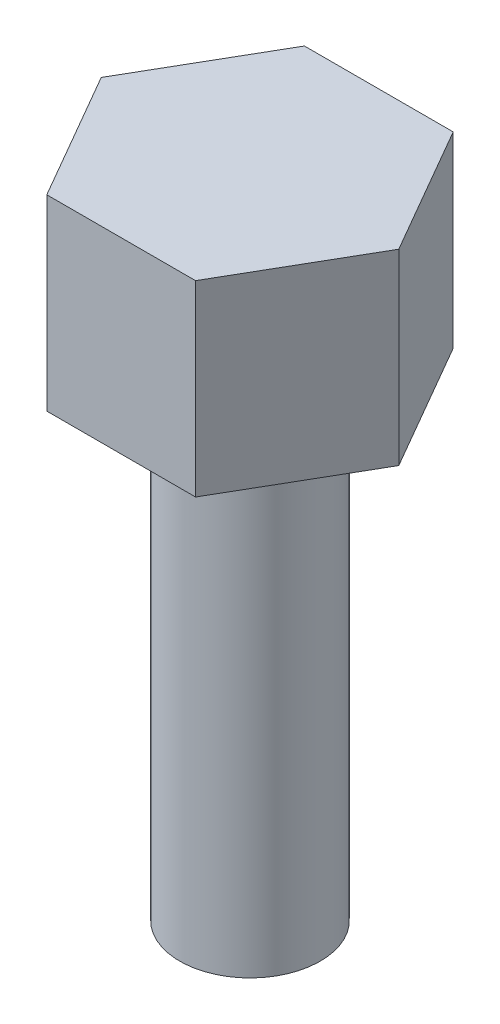
ISO-10303-21;
HEADER;
FILE_DESCRIPTION(('STEP AP214'),'2;1');
FILE_NAME('part.step','',(''),(''),'','','');
FILE_SCHEMA(('AUTOMOTIVE_DESIGN { 1 0 10303 214 1 1 1 1 }'));
ENDSEC;
DATA;
#1=APPLICATION_CONTEXT('core data for automotive mechanical design processes');
#2=APPLICATION_PROTOCOL_DEFINITION('international standard','automotive_design',2000,#1);
#3=PRODUCT_CONTEXT('',#1,'mechanical');
#4=PRODUCT('Part','Part','',(#3));
#5=PRODUCT_RELATED_PRODUCT_CATEGORY('part','',(#4));
#6=PRODUCT_DEFINITION_FORMATION('','',#4);
#7=PRODUCT_DEFINITION_CONTEXT('part definition',#1,'design');
#8=PRODUCT_DEFINITION('design','',#6,#7);
#9=PRODUCT_DEFINITION_SHAPE('','',#8);
#10=(LENGTH_UNIT() NAMED_UNIT(*) SI_UNIT(.MILLI.,.METRE.));
#11=(NAMED_UNIT(*) PLANE_ANGLE_UNIT() SI_UNIT($,.RADIAN.));
#12=(NAMED_UNIT(*) SI_UNIT($,.STERADIAN.) SOLID_ANGLE_UNIT());
#13=UNCERTAINTY_MEASURE_WITH_UNIT(LENGTH_MEASURE(1.E-05),#10,'distance_accuracy_value','');
#14=(GEOMETRIC_REPRESENTATION_CONTEXT(3) GLOBAL_UNCERTAINTY_ASSIGNED_CONTEXT((#13)) GLOBAL_UNIT_ASSIGNED_CONTEXT((#10,
#11,#12)) REPRESENTATION_CONTEXT('',''));
#15=CARTESIAN_POINT('',(0.,0.,0.));
#16=DIRECTION('',(0.,0.,1.));
#17=DIRECTION('',(1.,0.,0.));
#18=AXIS2_PLACEMENT_3D('',#15,#16,#17);
#19=CARTESIAN_POINT('',(1.58771324027147,4.,-2.75));
#20=DIRECTION('',(0.,0.,1.));
#21=DIRECTION('',(1.,0.,0.));
#22=AXIS2_PLACEMENT_3D('',#19,#20,#21);
#23=PLANE('',#22);
#24=DIRECTION('',(-1.,0.,0.));
#25=VECTOR('',#24,1.);
#26=CARTESIAN_POINT('',(1.58771324027147,0.,-2.75));
#27=LINE('',#26,#25);
#28=CARTESIAN_POINT('',(1.58771324027147,0.,-2.75));
#29=VERTEX_POINT('',#28);
#30=CARTESIAN_POINT('',(-1.58771324027147,0.,-2.75));
#31=VERTEX_POINT('',#30);
#32=EDGE_CURVE('E130',#29,#31,#27,.T.);
#33=ORIENTED_EDGE('',*,*,#32,.T.);
#34=DIRECTION('',(0.,-1.,0.));
#35=VECTOR('',#34,1.);
#36=CARTESIAN_POINT('',(-1.58771324027147,4.,-2.75));
#37=LINE('',#36,#35);
#38=CARTESIAN_POINT('',(-1.58771324027147,4.,-2.75));
#39=VERTEX_POINT('',#38);
#40=EDGE_CURVE('E42',#39,#31,#37,.T.);
#41=ORIENTED_EDGE('',*,*,#40,.F.);
#42=DIRECTION('',(-1.,0.,0.));
#43=VECTOR('',#42,1.);
#44=CARTESIAN_POINT('',(1.58771324027147,4.,-2.75));
#45=LINE('',#44,#43);
#46=CARTESIAN_POINT('',(1.58771324027147,4.,-2.75));
#47=VERTEX_POINT('',#46);
#48=EDGE_CURVE('E147',#47,#39,#45,.T.);
#49=ORIENTED_EDGE('',*,*,#48,.F.);
#50=DIRECTION('',(0.,-1.,0.));
#51=VECTOR('',#50,1.);
#52=CARTESIAN_POINT('',(1.58771324027147,4.,-2.75));
#53=LINE('',#52,#51);
#54=EDGE_CURVE('E126',#47,#29,#53,.T.);
#55=ORIENTED_EDGE('',*,*,#54,.T.);
#56=EDGE_LOOP('',(#33,#41,#49,#55));
#57=FACE_BOUND('',#56,.T.);
#58=ADVANCED_FACE('F39',(#57),#23,.F.);
#59=CARTESIAN_POINT('',(-1.58771324027147,4.,-2.75));
#60=DIRECTION('',(0.866025403784439,0.,0.5));
#61=DIRECTION('',(0.5,0.,-0.866025403784439));
#62=AXIS2_PLACEMENT_3D('',#59,#60,#61);
#63=PLANE('',#62);
#64=DIRECTION('',(-0.5,0.,0.866025403784439));
#65=VECTOR('',#64,1.);
#66=CARTESIAN_POINT('',(-1.58771324027147,0.,-2.75));
#67=LINE('',#66,#65);
#68=CARTESIAN_POINT('',(-3.17542648054294,0.,0.));
#69=VERTEX_POINT('',#68);
#70=EDGE_CURVE('E134',#31,#69,#67,.T.);
#71=ORIENTED_EDGE('',*,*,#70,.T.);
#72=DIRECTION('',(0.,-1.,0.));
#73=VECTOR('',#72,1.);
#74=CARTESIAN_POINT('',(-3.17542648054294,4.,0.));
#75=LINE('',#74,#73);
#76=CARTESIAN_POINT('',(-3.17542648054294,4.,0.));
#77=VERTEX_POINT('',#76);
#78=EDGE_CURVE('E153',#77,#69,#75,.T.);
#79=ORIENTED_EDGE('',*,*,#78,.F.);
#80=DIRECTION('',(-0.5,0.,0.866025403784439));
#81=VECTOR('',#80,1.);
#82=CARTESIAN_POINT('',(-1.58771324027147,4.,-2.75));
#83=LINE('',#82,#81);
#84=EDGE_CURVE('E95',#39,#77,#83,.T.);
#85=ORIENTED_EDGE('',*,*,#84,.F.);
#86=ORIENTED_EDGE('',*,*,#40,.T.);
#87=EDGE_LOOP('',(#71,#79,#85,#86));
#88=FACE_BOUND('',#87,.T.);
#89=ADVANCED_FACE('F160',(#88),#63,.F.);
#90=CARTESIAN_POINT('',(-3.17542648054294,4.,0.));
#91=DIRECTION('',(0.866025403784439,0.,-0.5));
#92=DIRECTION('',(-0.5,0.,-0.866025403784438));
#93=AXIS2_PLACEMENT_3D('',#90,#91,#92);
#94=PLANE('',#93);
#95=DIRECTION('',(0.5,0.,0.866025403784438));
#96=VECTOR('',#95,1.);
#97=CARTESIAN_POINT('',(-3.17542648054294,0.,0.));
#98=LINE('',#97,#96);
#99=CARTESIAN_POINT('',(-1.58771324027147,0.,2.75));
#100=VERTEX_POINT('',#99);
#101=EDGE_CURVE('E138',#69,#100,#98,.T.);
#102=ORIENTED_EDGE('',*,*,#101,.T.);
#103=DIRECTION('',(0.,-1.,0.));
#104=VECTOR('',#103,1.);
#105=CARTESIAN_POINT('',(-1.58771324027147,4.,2.75));
#106=LINE('',#105,#104);
#107=CARTESIAN_POINT('',(-1.58771324027147,4.,2.75));
#108=VERTEX_POINT('',#107);
#109=EDGE_CURVE('E119',#108,#100,#106,.T.);
#110=ORIENTED_EDGE('',*,*,#109,.F.);
#111=DIRECTION('',(0.5,0.,0.866025403784438));
#112=VECTOR('',#111,1.);
#113=CARTESIAN_POINT('',(-3.17542648054294,4.,0.));
#114=LINE('',#113,#112);
#115=EDGE_CURVE('E108',#77,#108,#114,.T.);
#116=ORIENTED_EDGE('',*,*,#115,.F.);
#117=ORIENTED_EDGE('',*,*,#78,.T.);
#118=EDGE_LOOP('',(#102,#110,#116,#117));
#119=FACE_BOUND('',#118,.T.);
#120=ADVANCED_FACE('F166',(#119),#94,.F.);
#121=CARTESIAN_POINT('',(-1.58771324027147,4.,2.75));
#122=DIRECTION('',(0.,0.,-1.));
#123=DIRECTION('',(-1.,0.,0.));
#124=AXIS2_PLACEMENT_3D('',#121,#122,#123);
#125=PLANE('',#124);
#126=DIRECTION('',(1.,0.,0.));
#127=VECTOR('',#126,1.);
#128=CARTESIAN_POINT('',(-1.58771324027147,0.,2.75));
#129=LINE('',#128,#127);
#130=CARTESIAN_POINT('',(1.58771324027147,0.,2.75));
#131=VERTEX_POINT('',#130);
#132=EDGE_CURVE('E117',#100,#131,#129,.T.);
#133=ORIENTED_EDGE('',*,*,#132,.T.);
#134=DIRECTION('',(0.,-1.,0.));
#135=VECTOR('',#134,1.);
#136=CARTESIAN_POINT('',(1.58771324027147,4.,2.75));
#137=LINE('',#136,#135);
#138=CARTESIAN_POINT('',(1.58771324027147,4.,2.75));
#139=VERTEX_POINT('',#138);
#140=EDGE_CURVE('E114',#139,#131,#137,.T.);
#141=ORIENTED_EDGE('',*,*,#140,.F.);
#142=DIRECTION('',(1.,0.,0.));
#143=VECTOR('',#142,1.);
#144=CARTESIAN_POINT('',(-1.58771324027147,4.,2.75));
#145=LINE('',#144,#143);
#146=EDGE_CURVE('E102',#108,#139,#145,.T.);
#147=ORIENTED_EDGE('',*,*,#146,.F.);
#148=ORIENTED_EDGE('',*,*,#109,.T.);
#149=EDGE_LOOP('',(#133,#141,#147,#148));
#150=FACE_BOUND('',#149,.T.);
#151=ADVANCED_FACE('F115',(#150),#125,.F.);
#152=CARTESIAN_POINT('',(1.58771324027147,4.,2.75));
#153=DIRECTION('',(-0.866025403784439,0.,-0.5));
#154=DIRECTION('',(-0.5,0.,0.866025403784439));
#155=AXIS2_PLACEMENT_3D('',#152,#153,#154);
#156=PLANE('',#155);
#157=DIRECTION('',(0.5,0.,-0.866025403784439));
#158=VECTOR('',#157,1.);
#159=CARTESIAN_POINT('',(1.58771324027147,0.,2.75));
#160=LINE('',#159,#158);
#161=CARTESIAN_POINT('',(3.17542648054294,0.,0.));
#162=VERTEX_POINT('',#161);
#163=EDGE_CURVE('E80',#131,#162,#160,.T.);
#164=ORIENTED_EDGE('',*,*,#163,.T.);
#165=DIRECTION('',(0.,-1.,0.));
#166=VECTOR('',#165,1.);
#167=CARTESIAN_POINT('',(3.17542648054294,4.,0.));
#168=LINE('',#167,#166);
#169=CARTESIAN_POINT('',(3.17542648054294,4.,0.));
#170=VERTEX_POINT('',#169);
#171=EDGE_CURVE('E120',#170,#162,#168,.T.);
#172=ORIENTED_EDGE('',*,*,#171,.F.);
#173=DIRECTION('',(0.5,0.,-0.866025403784439));
#174=VECTOR('',#173,1.);
#175=CARTESIAN_POINT('',(1.58771324027147,4.,2.75));
#176=LINE('',#175,#174);
#177=EDGE_CURVE('E106',#139,#170,#176,.T.);
#178=ORIENTED_EDGE('',*,*,#177,.F.);
#179=ORIENTED_EDGE('',*,*,#140,.T.);
#180=EDGE_LOOP('',(#164,#172,#178,#179));
#181=FACE_BOUND('',#180,.T.);
#182=ADVANCED_FACE('F122',(#181),#156,.F.);
#183=CARTESIAN_POINT('',(3.17542648054294,4.,0.));
#184=DIRECTION('',(-0.866025403784439,0.,0.5));
#185=DIRECTION('',(0.5,0.,0.866025403784439));
#186=AXIS2_PLACEMENT_3D('',#183,#184,#185);
#187=PLANE('',#186);
#188=DIRECTION('',(-0.5,0.,-0.866025403784439));
#189=VECTOR('',#188,1.);
#190=CARTESIAN_POINT('',(3.17542648054294,0.,0.));
#191=LINE('',#190,#189);
#192=EDGE_CURVE('E86',#162,#29,#191,.T.);
#193=ORIENTED_EDGE('',*,*,#192,.T.);
#194=ORIENTED_EDGE('',*,*,#54,.F.);
#195=DIRECTION('',(-0.5,0.,-0.866025403784439));
#196=VECTOR('',#195,1.);
#197=CARTESIAN_POINT('',(3.17542648054294,4.,0.));
#198=LINE('',#197,#196);
#199=EDGE_CURVE('E57',#170,#47,#198,.T.);
#200=ORIENTED_EDGE('',*,*,#199,.F.);
#201=ORIENTED_EDGE('',*,*,#171,.T.);
#202=EDGE_LOOP('',(#193,#194,#200,#201));
#203=FACE_BOUND('',#202,.T.);
#204=ADVANCED_FACE('F190',(#203),#187,.F.);
#205=CARTESIAN_POINT('',(0.,4.,0.));
#206=DIRECTION('',(0.,1.,0.));
#207=DIRECTION('',(0.,0.,1.));
#208=AXIS2_PLACEMENT_3D('',#205,#206,#207);
#209=PLANE('',#208);
#210=ORIENTED_EDGE('',*,*,#48,.T.);
#211=ORIENTED_EDGE('',*,*,#84,.T.);
#212=ORIENTED_EDGE('',*,*,#115,.T.);
#213=ORIENTED_EDGE('',*,*,#146,.T.);
#214=ORIENTED_EDGE('',*,*,#177,.T.);
#215=ORIENTED_EDGE('',*,*,#199,.T.);
#216=EDGE_LOOP('',(#210,#211,#212,#213,#214,#215));
#217=FACE_BOUND('',#216,.T.);
#218=ADVANCED_FACE('F104',(#217),#209,.T.);
#219=CARTESIAN_POINT('',(0.,0.,0.));
#220=DIRECTION('',(0.,1.,0.));
#221=DIRECTION('',(0.,0.,1.));
#222=AXIS2_PLACEMENT_3D('',#219,#220,#221);
#223=PLANE('',#222);
#224=CARTESIAN_POINT('',(0.,0.,0.));
#225=DIRECTION('',(0.,-1.,0.));
#226=DIRECTION('',(0.,0.,-1.));
#227=AXIS2_PLACEMENT_3D('',#224,#225,#226);
#228=CIRCLE('',#227,1.5);
#229=CARTESIAN_POINT('',(0.,0.,-1.5));
#230=VERTEX_POINT('',#229);
#231=EDGE_CURVE('E11',#230,#230,#228,.T.);
#232=ORIENTED_EDGE('',*,*,#231,.F.);
#233=EDGE_LOOP('',(#232));
#234=FACE_BOUND('',#233,.T.);
#235=ORIENTED_EDGE('',*,*,#32,.F.);
#236=ORIENTED_EDGE('',*,*,#192,.F.);
#237=ORIENTED_EDGE('',*,*,#163,.F.);
#238=ORIENTED_EDGE('',*,*,#132,.F.);
#239=ORIENTED_EDGE('',*,*,#101,.F.);
#240=ORIENTED_EDGE('',*,*,#70,.F.);
#241=EDGE_LOOP('',(#235,#236,#237,#238,#239,#240));
#242=FACE_BOUND('',#241,.T.);
#243=ADVANCED_FACE('F165',(#234,#242),#223,.F.);
#244=CARTESIAN_POINT('',(0.,-10.,0.));
#245=DIRECTION('',(0.,1.,0.));
#246=DIRECTION('',(0.,0.,1.));
#247=AXIS2_PLACEMENT_3D('',#244,#245,#246);
#248=CYLINDRICAL_SURFACE('',#247,1.5);
#249=CARTESIAN_POINT('',(0.,-10.,0.));
#250=DIRECTION('',(0.,-1.,0.));
#251=DIRECTION('',(0.,0.,-1.));
#252=AXIS2_PLACEMENT_3D('',#249,#250,#251);
#253=CIRCLE('',#252,1.5);
#254=CARTESIAN_POINT('',(0.,-10.,-1.5));
#255=VERTEX_POINT('',#254);
#256=EDGE_CURVE('E135',#255,#255,#253,.T.);
#257=ORIENTED_EDGE('',*,*,#256,.F.);
#258=EDGE_LOOP('',(#257));
#259=FACE_BOUND('',#258,.T.);
#260=ORIENTED_EDGE('',*,*,#231,.T.);
#261=EDGE_LOOP('',(#260));
#262=FACE_BOUND('',#261,.T.);
#263=ADVANCED_FACE('F179',(#259,#262),#248,.T.);
#264=CARTESIAN_POINT('',(0.,-10.,0.));
#265=DIRECTION('',(0.,-1.,0.));
#266=DIRECTION('',(0.,0.,-1.));
#267=AXIS2_PLACEMENT_3D('',#264,#265,#266);
#268=PLANE('',#267);
#269=ORIENTED_EDGE('',*,*,#256,.T.);
#270=EDGE_LOOP('',(#269));
#271=FACE_BOUND('',#270,.T.);
#272=ADVANCED_FACE('F177',(#271),#268,.T.);
#273=CLOSED_SHELL('',(#58,#89,#120,#151,#182,#204,#218,#243,#263,#272));
#274=MANIFOLD_SOLID_BREP('B2',#273);
#275=ADVANCED_BREP_SHAPE_REPRESENTATION('',(#18,#274),#14);
#276=SHAPE_DEFINITION_REPRESENTATION(#9,#275);
ENDSEC;
END-ISO-10303-21;
